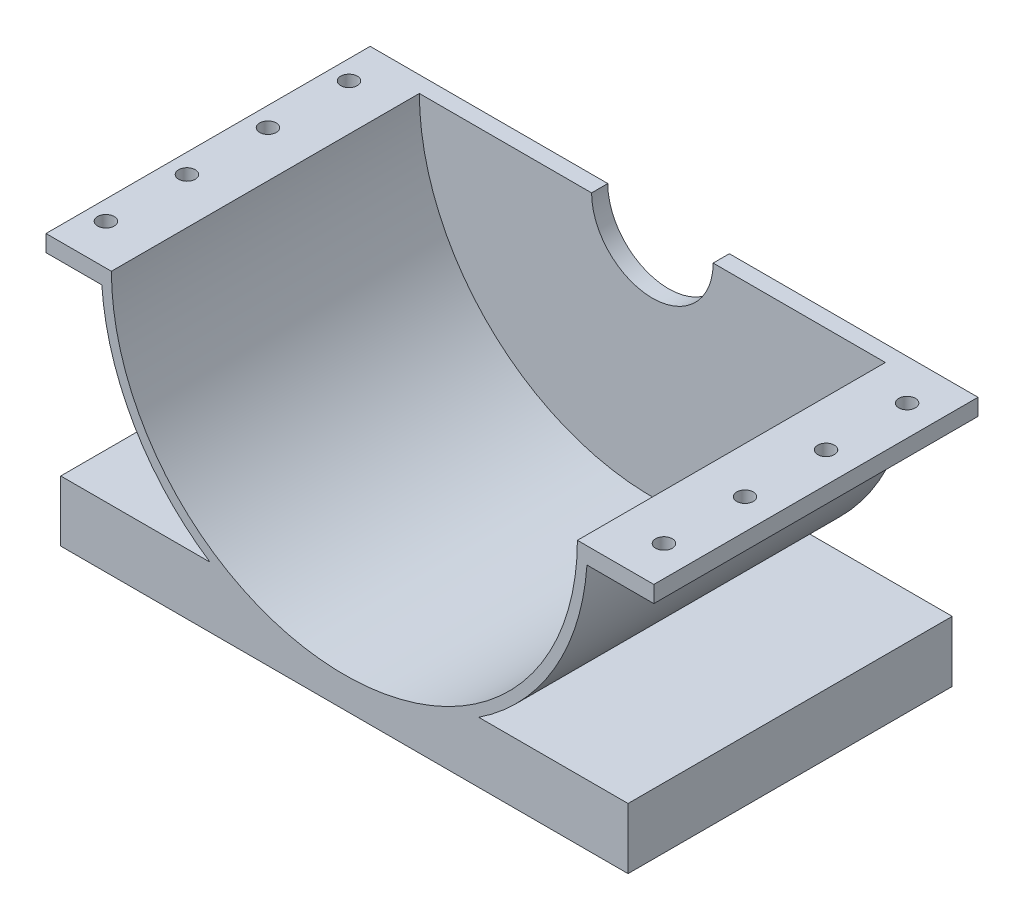
ISO-10303-21;
HEADER;
FILE_DESCRIPTION(('STEP AP214'),'2;1');
FILE_NAME('part.step','',(''),(''),'','','');
FILE_SCHEMA(('AUTOMOTIVE_DESIGN { 1 0 10303 214 1 1 1 1 }'));
ENDSEC;
DATA;
#1=APPLICATION_CONTEXT('core data for automotive mechanical design processes');
#2=APPLICATION_PROTOCOL_DEFINITION('international standard','automotive_design',2000,#1);
#3=PRODUCT_CONTEXT('',#1,'mechanical');
#4=PRODUCT('Part','Part','',(#3));
#5=PRODUCT_RELATED_PRODUCT_CATEGORY('part','',(#4));
#6=PRODUCT_DEFINITION_FORMATION('','',#4);
#7=PRODUCT_DEFINITION_CONTEXT('part definition',#1,'design');
#8=PRODUCT_DEFINITION('design','',#6,#7);
#9=PRODUCT_DEFINITION_SHAPE('','',#8);
#10=(LENGTH_UNIT() NAMED_UNIT(*) SI_UNIT(.MILLI.,.METRE.));
#11=(NAMED_UNIT(*) PLANE_ANGLE_UNIT() SI_UNIT($,.RADIAN.));
#12=(NAMED_UNIT(*) SI_UNIT($,.STERADIAN.) SOLID_ANGLE_UNIT());
#13=UNCERTAINTY_MEASURE_WITH_UNIT(LENGTH_MEASURE(1.E-05),#10,'distance_accuracy_value','');
#14=(GEOMETRIC_REPRESENTATION_CONTEXT(3) GLOBAL_UNCERTAINTY_ASSIGNED_CONTEXT((#13)) GLOBAL_UNIT_ASSIGNED_CONTEXT((#10,
#11,#12)) REPRESENTATION_CONTEXT('',''));
#15=CARTESIAN_POINT('',(0.,0.,0.));
#16=DIRECTION('',(0.,0.,1.));
#17=DIRECTION('',(1.,0.,0.));
#18=AXIS2_PLACEMENT_3D('',#15,#16,#17);
#19=CARTESIAN_POINT('',(-187.042762313304,0.,101.6));
#20=DIRECTION('',(0.,-1.,0.));
#21=DIRECTION('',(0.,0.,-1.));
#22=AXIS2_PLACEMENT_3D('',#19,#20,#21);
#23=PLANE('',#22);
#24=CARTESIAN_POINT('',(174.907237686696,0.,76.2));
#25=DIRECTION('',(0.,1.,0.));
#26=DIRECTION('',(0.,0.,1.));
#27=AXIS2_PLACEMENT_3D('',#24,#25,#26);
#28=CIRCLE('',#27,5.20699999999998);
#29=CARTESIAN_POINT('',(174.907237686696,0.,81.407));
#30=VERTEX_POINT('',#29);
#31=EDGE_CURVE('E218',#30,#30,#28,.T.);
#32=ORIENTED_EDGE('',*,*,#31,.F.);
#33=EDGE_LOOP('',(#32));
#34=FACE_BOUND('',#33,.T.);
#35=CARTESIAN_POINT('',(174.907237686696,0.,25.4));
#36=DIRECTION('',(0.,1.,0.));
#37=DIRECTION('',(0.,0.,1.));
#38=AXIS2_PLACEMENT_3D('',#35,#36,#37);
#39=CIRCLE('',#38,5.20699999999998);
#40=CARTESIAN_POINT('',(174.907237686696,0.,30.607));
#41=VERTEX_POINT('',#40);
#42=EDGE_CURVE('E402',#41,#41,#39,.T.);
#43=ORIENTED_EDGE('',*,*,#42,.F.);
#44=EDGE_LOOP('',(#43));
#45=FACE_BOUND('',#44,.T.);
#46=CARTESIAN_POINT('',(174.907237686696,0.,-25.4));
#47=DIRECTION('',(0.,1.,0.));
#48=DIRECTION('',(0.,0.,1.));
#49=AXIS2_PLACEMENT_3D('',#46,#47,#48);
#50=CIRCLE('',#49,5.20699999999998);
#51=CARTESIAN_POINT('',(174.907237686696,0.,-20.193));
#52=VERTEX_POINT('',#51);
#53=EDGE_CURVE('E405',#52,#52,#50,.T.);
#54=ORIENTED_EDGE('',*,*,#53,.F.);
#55=EDGE_LOOP('',(#54));
#56=FACE_BOUND('',#55,.T.);
#57=CARTESIAN_POINT('',(174.907237686696,0.,-76.2));
#58=DIRECTION('',(0.,1.,0.));
#59=DIRECTION('',(0.,0.,1.));
#60=AXIS2_PLACEMENT_3D('',#57,#58,#59);
#61=CIRCLE('',#60,5.20699999999998);
#62=CARTESIAN_POINT('',(174.907237686696,0.,-70.993));
#63=VERTEX_POINT('',#62);
#64=EDGE_CURVE('E399',#63,#63,#61,.T.);
#65=ORIENTED_EDGE('',*,*,#64,.F.);
#66=EDGE_LOOP('',(#65));
#67=FACE_BOUND('',#66,.T.);
#68=DIRECTION('',(-1.,0.,0.));
#69=VECTOR('',#68,1.);
#70=CARTESIAN_POINT('',(-187.042762313304,0.,-101.6));
#71=LINE('',#70,#69);
#72=CARTESIAN_POINT('',(193.957237686696,0.,-101.6));
#73=VERTEX_POINT('',#72);
#74=CARTESIAN_POINT('',(38.1,0.,-101.6));
#75=VERTEX_POINT('',#74);
#76=EDGE_CURVE('E166',#73,#75,#71,.T.);
#77=ORIENTED_EDGE('',*,*,#76,.T.);
#78=DIRECTION('',(0.,0.,1.));
#79=VECTOR('',#78,1.);
#80=CARTESIAN_POINT('',(38.1,0.,-101.6));
#81=LINE('',#80,#79);
#82=CARTESIAN_POINT('',(38.1,0.,-91.44));
#83=VERTEX_POINT('',#82);
#84=EDGE_CURVE('E151',#75,#83,#81,.T.);
#85=ORIENTED_EDGE('',*,*,#84,.T.);
#86=DIRECTION('',(-1.,0.,0.));
#87=VECTOR('',#86,1.);
#88=CARTESIAN_POINT('',(-146.05,0.,-91.44));
#89=LINE('',#88,#87);
#90=CARTESIAN_POINT('',(146.05,0.,-91.44));
#91=VERTEX_POINT('',#90);
#92=EDGE_CURVE('E236',#91,#83,#89,.T.);
#93=ORIENTED_EDGE('',*,*,#92,.F.);
#94=DIRECTION('',(0.,0.,1.));
#95=VECTOR('',#94,1.);
#96=CARTESIAN_POINT('',(146.05,0.,-91.44));
#97=LINE('',#96,#95);
#98=CARTESIAN_POINT('',(146.05,0.,101.6));
#99=VERTEX_POINT('',#98);
#100=EDGE_CURVE('E238',#91,#99,#97,.T.);
#101=ORIENTED_EDGE('',*,*,#100,.T.);
#102=DIRECTION('',(-1.,0.,0.));
#103=VECTOR('',#102,1.);
#104=CARTESIAN_POINT('',(-187.042762313304,0.,101.6));
#105=LINE('',#104,#103);
#106=CARTESIAN_POINT('',(193.957237686696,0.,101.6));
#107=VERTEX_POINT('',#106);
#108=EDGE_CURVE('E186',#107,#99,#105,.T.);
#109=ORIENTED_EDGE('',*,*,#108,.F.);
#110=DIRECTION('',(0.,0.,-1.));
#111=VECTOR('',#110,1.);
#112=CARTESIAN_POINT('',(193.957237686696,0.,101.6));
#113=LINE('',#112,#111);
#114=EDGE_CURVE('E173',#107,#73,#113,.T.);
#115=ORIENTED_EDGE('',*,*,#114,.T.);
#116=EDGE_LOOP('',(#77,#85,#93,#101,#109,#115));
#117=FACE_BOUND('',#116,.T.);
#118=ADVANCED_FACE('F37',(#34,#45,#56,#67,#117),#23,.F.);
#119=CARTESIAN_POINT('',(-187.042762313304,0.,101.6));
#120=DIRECTION('',(1.,0.,0.));
#121=DIRECTION('',(0.,0.,-1.));
#122=AXIS2_PLACEMENT_3D('',#119,#120,#121);
#123=PLANE('',#122);
#124=DIRECTION('',(0.,-1.,0.));
#125=VECTOR('',#124,1.);
#126=CARTESIAN_POINT('',(-187.042762313304,0.,-101.6));
#127=LINE('',#126,#125);
#128=CARTESIAN_POINT('',(-187.042762313304,0.,-101.6));
#129=VERTEX_POINT('',#128);
#130=CARTESIAN_POINT('',(-187.042762313304,-10.414,-101.6));
#131=VERTEX_POINT('',#130);
#132=EDGE_CURVE('E241',#129,#131,#127,.T.);
#133=ORIENTED_EDGE('',*,*,#132,.T.);
#134=DIRECTION('',(0.,0.,-1.));
#135=VECTOR('',#134,1.);
#136=CARTESIAN_POINT('',(-187.042762313304,-10.414,101.6));
#137=LINE('',#136,#135);
#138=CARTESIAN_POINT('',(-187.042762313304,-10.414,101.6));
#139=VERTEX_POINT('',#138);
#140=EDGE_CURVE('E11',#139,#131,#137,.T.);
#141=ORIENTED_EDGE('',*,*,#140,.F.);
#142=DIRECTION('',(0.,-1.,0.));
#143=VECTOR('',#142,1.);
#144=CARTESIAN_POINT('',(-187.042762313304,0.,101.6));
#145=LINE('',#144,#143);
#146=CARTESIAN_POINT('',(-187.042762313304,0.,101.6));
#147=VERTEX_POINT('',#146);
#148=EDGE_CURVE('E174',#147,#139,#145,.T.);
#149=ORIENTED_EDGE('',*,*,#148,.F.);
#150=DIRECTION('',(0.,0.,-1.));
#151=VECTOR('',#150,1.);
#152=CARTESIAN_POINT('',(-187.042762313304,0.,101.6));
#153=LINE('',#152,#151);
#154=EDGE_CURVE('E183',#147,#129,#153,.T.);
#155=ORIENTED_EDGE('',*,*,#154,.T.);
#156=EDGE_LOOP('',(#133,#141,#149,#155));
#157=FACE_BOUND('',#156,.T.);
#158=ADVANCED_FACE('F39',(#157),#123,.F.);
#159=CARTESIAN_POINT('',(-187.042762313304,-10.414,101.6));
#160=DIRECTION('',(0.,1.,0.));
#161=DIRECTION('',(0.,0.,1.));
#162=AXIS2_PLACEMENT_3D('',#159,#160,#161);
#163=PLANE('',#162);
#164=CARTESIAN_POINT('',(-174.907237686696,-10.414,76.2));
#165=DIRECTION('',(0.,1.,0.));
#166=DIRECTION('',(0.,0.,1.));
#167=AXIS2_PLACEMENT_3D('',#164,#165,#166);
#168=CIRCLE('',#167,5.20699999999998);
#169=CARTESIAN_POINT('',(-174.907237686696,-10.414,81.407));
#170=VERTEX_POINT('',#169);
#171=EDGE_CURVE('E396',#170,#170,#168,.F.);
#172=ORIENTED_EDGE('',*,*,#171,.F.);
#173=EDGE_LOOP('',(#172));
#174=FACE_BOUND('',#173,.T.);
#175=CARTESIAN_POINT('',(-174.907237686696,-10.414,25.4));
#176=DIRECTION('',(0.,1.,0.));
#177=DIRECTION('',(0.,0.,1.));
#178=AXIS2_PLACEMENT_3D('',#175,#176,#177);
#179=CIRCLE('',#178,5.20699999999998);
#180=CARTESIAN_POINT('',(-174.907237686696,-10.414,30.607));
#181=VERTEX_POINT('',#180);
#182=EDGE_CURVE('E393',#181,#181,#179,.F.);
#183=ORIENTED_EDGE('',*,*,#182,.F.);
#184=EDGE_LOOP('',(#183));
#185=FACE_BOUND('',#184,.T.);
#186=CARTESIAN_POINT('',(-174.907237686696,-10.414,-25.4));
#187=DIRECTION('',(0.,1.,0.));
#188=DIRECTION('',(0.,0.,1.));
#189=AXIS2_PLACEMENT_3D('',#186,#187,#188);
#190=CIRCLE('',#189,5.20699999999998);
#191=CARTESIAN_POINT('',(-174.907237686696,-10.414,-20.193));
#192=VERTEX_POINT('',#191);
#193=EDGE_CURVE('E390',#192,#192,#190,.F.);
#194=ORIENTED_EDGE('',*,*,#193,.F.);
#195=EDGE_LOOP('',(#194));
#196=FACE_BOUND('',#195,.T.);
#197=CARTESIAN_POINT('',(-174.907237686696,-10.414,-76.2));
#198=DIRECTION('',(0.,1.,0.));
#199=DIRECTION('',(0.,0.,1.));
#200=AXIS2_PLACEMENT_3D('',#197,#198,#199);
#201=CIRCLE('',#200,5.20699999999998);
#202=CARTESIAN_POINT('',(-174.907237686696,-10.414,-70.993));
#203=VERTEX_POINT('',#202);
#204=EDGE_CURVE('E387',#203,#203,#201,.F.);
#205=ORIENTED_EDGE('',*,*,#204,.F.);
#206=EDGE_LOOP('',(#205));
#207=FACE_BOUND('',#206,.T.);
#208=DIRECTION('',(1.,0.,0.));
#209=VECTOR('',#208,1.);
#210=CARTESIAN_POINT('',(-187.042762313304,-10.414,-101.6));
#211=LINE('',#210,#209);
#212=CARTESIAN_POINT('',(-152.04377200004,-10.4139999999999,-101.6));
#213=VERTEX_POINT('',#212);
#214=EDGE_CURVE('E268',#131,#213,#211,.T.);
#215=ORIENTED_EDGE('',*,*,#214,.T.);
#216=DIRECTION('',(0.,0.,-1.));
#217=VECTOR('',#216,1.);
#218=CARTESIAN_POINT('',(-152.04377200004,-10.4139999999999,101.6));
#219=LINE('',#218,#217);
#220=CARTESIAN_POINT('',(-152.04377200004,-10.4139999999999,101.6));
#221=VERTEX_POINT('',#220);
#222=EDGE_CURVE('E46',#221,#213,#219,.T.);
#223=ORIENTED_EDGE('',*,*,#222,.F.);
#224=DIRECTION('',(1.,0.,0.));
#225=VECTOR('',#224,1.);
#226=CARTESIAN_POINT('',(-187.042762313304,-10.414,101.6));
#227=LINE('',#226,#225);
#228=EDGE_CURVE('E177',#139,#221,#227,.T.);
#229=ORIENTED_EDGE('',*,*,#228,.F.);
#230=ORIENTED_EDGE('',*,*,#140,.T.);
#231=EDGE_LOOP('',(#215,#223,#229,#230));
#232=FACE_BOUND('',#231,.T.);
#233=ADVANCED_FACE('F331',(#174,#185,#196,#207,#232),#163,.F.);
#234=CARTESIAN_POINT('',(0.,0.,101.6));
#235=DIRECTION('',(0.,0.,-1.));
#236=DIRECTION('',(-1.,0.,0.));
#237=AXIS2_PLACEMENT_3D('',#234,#235,#236);
#238=CYLINDRICAL_SURFACE('',#237,152.4);
#239=CARTESIAN_POINT('',(0.,0.,-101.6));
#240=DIRECTION('',(0.,0.,1.));
#241=DIRECTION('',(1.,0.,0.));
#242=AXIS2_PLACEMENT_3D('',#239,#240,#241);
#243=CIRCLE('',#242,152.4);
#244=CARTESIAN_POINT('',(-84.2422696750272,-127.,-101.6));
#245=VERTEX_POINT('',#244);
#246=EDGE_CURVE('E270',#213,#245,#243,.T.);
#247=ORIENTED_EDGE('',*,*,#246,.T.);
#248=DIRECTION('',(0.,0.,-1.));
#249=VECTOR('',#248,1.);
#250=CARTESIAN_POINT('',(-84.2422696750272,-127.,101.6));
#251=LINE('',#250,#249);
#252=CARTESIAN_POINT('',(-84.2422696750272,-127.,101.6));
#253=VERTEX_POINT('',#252);
#254=EDGE_CURVE('E209',#253,#245,#251,.T.);
#255=ORIENTED_EDGE('',*,*,#254,.F.);
#256=CARTESIAN_POINT('',(0.,0.,101.6));
#257=DIRECTION('',(0.,0.,1.));
#258=DIRECTION('',(1.,0.,0.));
#259=AXIS2_PLACEMENT_3D('',#256,#257,#258);
#260=CIRCLE('',#259,152.4);
#261=EDGE_CURVE('E245',#221,#253,#260,.T.);
#262=ORIENTED_EDGE('',*,*,#261,.F.);
#263=ORIENTED_EDGE('',*,*,#222,.T.);
#264=EDGE_LOOP('',(#247,#255,#262,#263));
#265=FACE_BOUND('',#264,.T.);
#266=ADVANCED_FACE('F327',(#265),#238,.T.);
#267=CARTESIAN_POINT('',(-177.8,-127.,101.6));
#268=DIRECTION('',(0.,-1.,0.));
#269=DIRECTION('',(0.,0.,-1.));
#270=AXIS2_PLACEMENT_3D('',#267,#268,#269);
#271=PLANE('',#270);
#272=DIRECTION('',(-1.,0.,0.));
#273=VECTOR('',#272,1.);
#274=CARTESIAN_POINT('',(-177.8,-127.,-101.6));
#275=LINE('',#274,#273);
#276=CARTESIAN_POINT('',(-177.8,-127.,-101.6));
#277=VERTEX_POINT('',#276);
#278=EDGE_CURVE('E272',#245,#277,#275,.T.);
#279=ORIENTED_EDGE('',*,*,#278,.T.);
#280=DIRECTION('',(0.,0.,-1.));
#281=VECTOR('',#280,1.);
#282=CARTESIAN_POINT('',(-177.8,-127.,101.6));
#283=LINE('',#282,#281);
#284=CARTESIAN_POINT('',(-177.8,-127.,101.6));
#285=VERTEX_POINT('',#284);
#286=EDGE_CURVE('E206',#285,#277,#283,.T.);
#287=ORIENTED_EDGE('',*,*,#286,.F.);
#288=DIRECTION('',(-1.,0.,0.));
#289=VECTOR('',#288,1.);
#290=CARTESIAN_POINT('',(-177.8,-127.,101.6));
#291=LINE('',#290,#289);
#292=EDGE_CURVE('E247',#253,#285,#291,.T.);
#293=ORIENTED_EDGE('',*,*,#292,.F.);
#294=ORIENTED_EDGE('',*,*,#254,.T.);
#295=EDGE_LOOP('',(#279,#287,#293,#294));
#296=FACE_BOUND('',#295,.T.);
#297=ADVANCED_FACE('F323',(#296),#271,.F.);
#298=CARTESIAN_POINT('',(-177.8,-127.,101.6));
#299=DIRECTION('',(1.,0.,0.));
#300=DIRECTION('',(0.,1.,0.));
#301=AXIS2_PLACEMENT_3D('',#298,#299,#300);
#302=PLANE('',#301);
#303=DIRECTION('',(0.,-1.,0.));
#304=VECTOR('',#303,1.);
#305=CARTESIAN_POINT('',(-177.8,-127.,-101.6));
#306=LINE('',#305,#304);
#307=CARTESIAN_POINT('',(-177.8,-165.1,-101.6));
#308=VERTEX_POINT('',#307);
#309=EDGE_CURVE('E274',#277,#308,#306,.T.);
#310=ORIENTED_EDGE('',*,*,#309,.T.);
#311=DIRECTION('',(0.,0.,-1.));
#312=VECTOR('',#311,1.);
#313=CARTESIAN_POINT('',(-177.8,-165.1,101.6));
#314=LINE('',#313,#312);
#315=CARTESIAN_POINT('',(-177.8,-165.1,101.6));
#316=VERTEX_POINT('',#315);
#317=EDGE_CURVE('E203',#316,#308,#314,.T.);
#318=ORIENTED_EDGE('',*,*,#317,.F.);
#319=DIRECTION('',(0.,-1.,0.));
#320=VECTOR('',#319,1.);
#321=CARTESIAN_POINT('',(-177.8,-127.,101.6));
#322=LINE('',#321,#320);
#323=EDGE_CURVE('E249',#285,#316,#322,.T.);
#324=ORIENTED_EDGE('',*,*,#323,.F.);
#325=ORIENTED_EDGE('',*,*,#286,.T.);
#326=EDGE_LOOP('',(#310,#318,#324,#325));
#327=FACE_BOUND('',#326,.T.);
#328=ADVANCED_FACE('F319',(#327),#302,.F.);
#329=CARTESIAN_POINT('',(-177.8,-165.1,101.6));
#330=DIRECTION('',(0.,1.,0.));
#331=DIRECTION('',(0.,0.,1.));
#332=AXIS2_PLACEMENT_3D('',#329,#330,#331);
#333=PLANE('',#332);
#334=DIRECTION('',(1.,0.,0.));
#335=VECTOR('',#334,1.);
#336=CARTESIAN_POINT('',(-177.8,-165.1,-101.6));
#337=LINE('',#336,#335);
#338=CARTESIAN_POINT('',(177.8,-165.1,-101.6));
#339=VERTEX_POINT('',#338);
#340=EDGE_CURVE('E276',#308,#339,#337,.T.);
#341=ORIENTED_EDGE('',*,*,#340,.T.);
#342=DIRECTION('',(0.,0.,-1.));
#343=VECTOR('',#342,1.);
#344=CARTESIAN_POINT('',(177.8,-165.1,101.6));
#345=LINE('',#344,#343);
#346=CARTESIAN_POINT('',(177.8,-165.1,101.6));
#347=VERTEX_POINT('',#346);
#348=EDGE_CURVE('E200',#347,#339,#345,.T.);
#349=ORIENTED_EDGE('',*,*,#348,.F.);
#350=DIRECTION('',(1.,0.,0.));
#351=VECTOR('',#350,1.);
#352=CARTESIAN_POINT('',(-177.8,-165.1,101.6));
#353=LINE('',#352,#351);
#354=EDGE_CURVE('E251',#316,#347,#353,.T.);
#355=ORIENTED_EDGE('',*,*,#354,.F.);
#356=ORIENTED_EDGE('',*,*,#317,.T.);
#357=EDGE_LOOP('',(#341,#349,#355,#356));
#358=FACE_BOUND('',#357,.T.);
#359=ADVANCED_FACE('F314',(#358),#333,.F.);
#360=CARTESIAN_POINT('',(177.8,-127.,101.6));
#361=DIRECTION('',(-1.,0.,0.));
#362=DIRECTION('',(0.,-1.,0.));
#363=AXIS2_PLACEMENT_3D('',#360,#361,#362);
#364=PLANE('',#363);
#365=DIRECTION('',(0.,1.,0.));
#366=VECTOR('',#365,1.);
#367=CARTESIAN_POINT('',(177.8,-127.,-101.6));
#368=LINE('',#367,#366);
#369=CARTESIAN_POINT('',(177.8,-127.,-101.6));
#370=VERTEX_POINT('',#369);
#371=EDGE_CURVE('E278',#339,#370,#368,.T.);
#372=ORIENTED_EDGE('',*,*,#371,.T.);
#373=DIRECTION('',(0.,0.,-1.));
#374=VECTOR('',#373,1.);
#375=CARTESIAN_POINT('',(177.8,-127.,101.6));
#376=LINE('',#375,#374);
#377=CARTESIAN_POINT('',(177.8,-127.,101.6));
#378=VERTEX_POINT('',#377);
#379=EDGE_CURVE('E197',#378,#370,#376,.T.);
#380=ORIENTED_EDGE('',*,*,#379,.F.);
#381=DIRECTION('',(0.,1.,0.));
#382=VECTOR('',#381,1.);
#383=CARTESIAN_POINT('',(177.8,-127.,101.6));
#384=LINE('',#383,#382);
#385=EDGE_CURVE('E253',#347,#378,#384,.T.);
#386=ORIENTED_EDGE('',*,*,#385,.F.);
#387=ORIENTED_EDGE('',*,*,#348,.T.);
#388=EDGE_LOOP('',(#372,#380,#386,#387));
#389=FACE_BOUND('',#388,.T.);
#390=ADVANCED_FACE('F308',(#389),#364,.F.);
#391=CARTESIAN_POINT('',(84.2422696750272,-127.,101.6));
#392=DIRECTION('',(0.,-1.,0.));
#393=DIRECTION('',(0.,0.,-1.));
#394=AXIS2_PLACEMENT_3D('',#391,#392,#393);
#395=PLANE('',#394);
#396=DIRECTION('',(-1.,0.,0.));
#397=VECTOR('',#396,1.);
#398=CARTESIAN_POINT('',(84.2422696750272,-127.,-101.6));
#399=LINE('',#398,#397);
#400=CARTESIAN_POINT('',(84.2422696750272,-127.,-101.6));
#401=VERTEX_POINT('',#400);
#402=EDGE_CURVE('E280',#370,#401,#399,.T.);
#403=ORIENTED_EDGE('',*,*,#402,.T.);
#404=DIRECTION('',(0.,0.,-1.));
#405=VECTOR('',#404,1.);
#406=CARTESIAN_POINT('',(84.2422696750272,-127.,101.6));
#407=LINE('',#406,#405);
#408=CARTESIAN_POINT('',(84.2422696750272,-127.,101.6));
#409=VERTEX_POINT('',#408);
#410=EDGE_CURVE('E194',#409,#401,#407,.T.);
#411=ORIENTED_EDGE('',*,*,#410,.F.);
#412=DIRECTION('',(-1.,0.,0.));
#413=VECTOR('',#412,1.);
#414=CARTESIAN_POINT('',(84.2422696750272,-127.,101.6));
#415=LINE('',#414,#413);
#416=EDGE_CURVE('E255',#378,#409,#415,.T.);
#417=ORIENTED_EDGE('',*,*,#416,.F.);
#418=ORIENTED_EDGE('',*,*,#379,.T.);
#419=EDGE_LOOP('',(#403,#411,#417,#418));
#420=FACE_BOUND('',#419,.T.);
#421=ADVANCED_FACE('F306',(#420),#395,.F.);
#422=CARTESIAN_POINT('',(0.,0.,101.6));
#423=DIRECTION('',(0.,0.,-1.));
#424=DIRECTION('',(-1.,0.,0.));
#425=AXIS2_PLACEMENT_3D('',#422,#423,#424);
#426=CYLINDRICAL_SURFACE('',#425,152.4);
#427=CARTESIAN_POINT('',(0.,0.,-101.6));
#428=DIRECTION('',(0.,0.,1.));
#429=DIRECTION('',(1.,0.,0.));
#430=AXIS2_PLACEMENT_3D('',#427,#428,#429);
#431=CIRCLE('',#430,152.4);
#432=CARTESIAN_POINT('',(152.04377200004,-10.414,-101.6));
#433=VERTEX_POINT('',#432);
#434=EDGE_CURVE('E282',#401,#433,#431,.T.);
#435=ORIENTED_EDGE('',*,*,#434,.T.);
#436=DIRECTION('',(0.,0.,-1.));
#437=VECTOR('',#436,1.);
#438=CARTESIAN_POINT('',(152.04377200004,-10.414,101.6));
#439=LINE('',#438,#437);
#440=CARTESIAN_POINT('',(152.04377200004,-10.414,101.6));
#441=VERTEX_POINT('',#440);
#442=EDGE_CURVE('E191',#441,#433,#439,.T.);
#443=ORIENTED_EDGE('',*,*,#442,.F.);
#444=CARTESIAN_POINT('',(0.,0.,101.6));
#445=DIRECTION('',(0.,0.,1.));
#446=DIRECTION('',(1.,0.,0.));
#447=AXIS2_PLACEMENT_3D('',#444,#445,#446);
#448=CIRCLE('',#447,152.4);
#449=EDGE_CURVE('E257',#409,#441,#448,.T.);
#450=ORIENTED_EDGE('',*,*,#449,.F.);
#451=ORIENTED_EDGE('',*,*,#410,.T.);
#452=EDGE_LOOP('',(#435,#443,#450,#451));
#453=FACE_BOUND('',#452,.T.);
#454=ADVANCED_FACE('F295',(#453),#426,.T.);
#455=CARTESIAN_POINT('',(152.04377200004,-10.414,101.6));
#456=DIRECTION('',(0.,1.,0.));
#457=DIRECTION('',(0.,0.,1.));
#458=AXIS2_PLACEMENT_3D('',#455,#456,#457);
#459=PLANE('',#458);
#460=CARTESIAN_POINT('',(174.907237686696,-10.414,76.2));
#461=DIRECTION('',(0.,1.,0.));
#462=DIRECTION('',(0.,0.,1.));
#463=AXIS2_PLACEMENT_3D('',#460,#461,#462);
#464=CIRCLE('',#463,5.20699999999998);
#465=CARTESIAN_POINT('',(174.907237686696,-10.414,81.407));
#466=VERTEX_POINT('',#465);
#467=EDGE_CURVE('E41',#466,#466,#464,.T.);
#468=ORIENTED_EDGE('',*,*,#467,.T.);
#469=EDGE_LOOP('',(#468));
#470=FACE_BOUND('',#469,.T.);
#471=CARTESIAN_POINT('',(174.907237686696,-10.414,25.4));
#472=DIRECTION('',(0.,1.,0.));
#473=DIRECTION('',(0.,0.,1.));
#474=AXIS2_PLACEMENT_3D('',#471,#472,#473);
#475=CIRCLE('',#474,5.20699999999998);
#476=CARTESIAN_POINT('',(174.907237686696,-10.414,30.607));
#477=VERTEX_POINT('',#476);
#478=EDGE_CURVE('E220',#477,#477,#475,.T.);
#479=ORIENTED_EDGE('',*,*,#478,.T.);
#480=EDGE_LOOP('',(#479));
#481=FACE_BOUND('',#480,.T.);
#482=CARTESIAN_POINT('',(174.907237686696,-10.414,-25.4));
#483=DIRECTION('',(0.,1.,0.));
#484=DIRECTION('',(0.,0.,1.));
#485=AXIS2_PLACEMENT_3D('',#482,#483,#484);
#486=CIRCLE('',#485,5.20699999999998);
#487=CARTESIAN_POINT('',(174.907237686696,-10.414,-20.193));
#488=VERTEX_POINT('',#487);
#489=EDGE_CURVE('E217',#488,#488,#486,.T.);
#490=ORIENTED_EDGE('',*,*,#489,.T.);
#491=EDGE_LOOP('',(#490));
#492=FACE_BOUND('',#491,.T.);
#493=CARTESIAN_POINT('',(174.907237686696,-10.414,-76.2));
#494=DIRECTION('',(0.,1.,0.));
#495=DIRECTION('',(0.,0.,1.));
#496=AXIS2_PLACEMENT_3D('',#493,#494,#495);
#497=CIRCLE('',#496,5.20699999999998);
#498=CARTESIAN_POINT('',(174.907237686696,-10.414,-70.993));
#499=VERTEX_POINT('',#498);
#500=EDGE_CURVE('E214',#499,#499,#497,.T.);
#501=ORIENTED_EDGE('',*,*,#500,.T.);
#502=EDGE_LOOP('',(#501));
#503=FACE_BOUND('',#502,.T.);
#504=DIRECTION('',(1.,0.,0.));
#505=VECTOR('',#504,1.);
#506=CARTESIAN_POINT('',(152.04377200004,-10.414,-101.6));
#507=LINE('',#506,#505);
#508=CARTESIAN_POINT('',(193.957237686696,-10.414,-101.6));
#509=VERTEX_POINT('',#508);
#510=EDGE_CURVE('E283',#433,#509,#507,.T.);
#511=ORIENTED_EDGE('',*,*,#510,.T.);
#512=DIRECTION('',(0.,0.,-1.));
#513=VECTOR('',#512,1.);
#514=CARTESIAN_POINT('',(193.957237686696,-10.414,101.6));
#515=LINE('',#514,#513);
#516=CARTESIAN_POINT('',(193.957237686696,-10.414,101.6));
#517=VERTEX_POINT('',#516);
#518=EDGE_CURVE('E188',#517,#509,#515,.T.);
#519=ORIENTED_EDGE('',*,*,#518,.F.);
#520=DIRECTION('',(1.,0.,0.));
#521=VECTOR('',#520,1.);
#522=CARTESIAN_POINT('',(152.04377200004,-10.414,101.6));
#523=LINE('',#522,#521);
#524=EDGE_CURVE('E259',#441,#517,#523,.T.);
#525=ORIENTED_EDGE('',*,*,#524,.F.);
#526=ORIENTED_EDGE('',*,*,#442,.T.);
#527=EDGE_LOOP('',(#511,#519,#525,#526));
#528=FACE_BOUND('',#527,.T.);
#529=ADVANCED_FACE('F299',(#470,#481,#492,#503,#528),#459,.F.);
#530=CARTESIAN_POINT('',(193.957237686696,-10.414,101.6));
#531=DIRECTION('',(-1.,0.,0.));
#532=DIRECTION('',(0.,0.,1.));
#533=AXIS2_PLACEMENT_3D('',#530,#531,#532);
#534=PLANE('',#533);
#535=DIRECTION('',(0.,1.,0.));
#536=VECTOR('',#535,1.);
#537=CARTESIAN_POINT('',(193.957237686696,-10.414,-101.6));
#538=LINE('',#537,#536);
#539=EDGE_CURVE('E179',#509,#73,#538,.T.);
#540=ORIENTED_EDGE('',*,*,#539,.T.);
#541=ORIENTED_EDGE('',*,*,#114,.F.);
#542=DIRECTION('',(0.,1.,0.));
#543=VECTOR('',#542,1.);
#544=CARTESIAN_POINT('',(193.957237686696,-10.414,101.6));
#545=LINE('',#544,#543);
#546=EDGE_CURVE('E261',#517,#107,#545,.T.);
#547=ORIENTED_EDGE('',*,*,#546,.F.);
#548=ORIENTED_EDGE('',*,*,#518,.T.);
#549=EDGE_LOOP('',(#540,#541,#547,#548));
#550=FACE_BOUND('',#549,.T.);
#551=ADVANCED_FACE('F288',(#550),#534,.F.);
#552=CARTESIAN_POINT('',(-174.907237686696,0.,76.2));
#553=DIRECTION('',(0.,-1.,0.));
#554=DIRECTION('',(0.,0.,1.));
#555=AXIS2_PLACEMENT_3D('',#552,#553,#554);
#556=CIRCLE('',#555,5.20699999999998);
#557=CARTESIAN_POINT('',(-174.907237686696,0.,81.407));
#558=VERTEX_POINT('',#557);
#559=EDGE_CURVE('E370',#558,#558,#556,.T.);
#560=ORIENTED_EDGE('',*,*,#559,.T.);
#561=EDGE_LOOP('',(#560));
#562=FACE_BOUND('',#561,.T.);
#563=CARTESIAN_POINT('',(-174.907237686696,0.,25.4));
#564=DIRECTION('',(0.,-1.,0.));
#565=DIRECTION('',(0.,0.,1.));
#566=AXIS2_PLACEMENT_3D('',#563,#564,#565);
#567=CIRCLE('',#566,5.20699999999998);
#568=CARTESIAN_POINT('',(-174.907237686696,0.,30.607));
#569=VERTEX_POINT('',#568);
#570=EDGE_CURVE('E374',#569,#569,#567,.T.);
#571=ORIENTED_EDGE('',*,*,#570,.T.);
#572=EDGE_LOOP('',(#571));
#573=FACE_BOUND('',#572,.T.);
#574=CARTESIAN_POINT('',(-174.907237686696,0.,-25.4));
#575=DIRECTION('',(0.,-1.,0.));
#576=DIRECTION('',(0.,0.,1.));
#577=AXIS2_PLACEMENT_3D('',#574,#575,#576);
#578=CIRCLE('',#577,5.20699999999998);
#579=CARTESIAN_POINT('',(-174.907237686696,0.,-20.193));
#580=VERTEX_POINT('',#579);
#581=EDGE_CURVE('E378',#580,#580,#578,.T.);
#582=ORIENTED_EDGE('',*,*,#581,.T.);
#583=EDGE_LOOP('',(#582));
#584=FACE_BOUND('',#583,.T.);
#585=CARTESIAN_POINT('',(-174.907237686696,0.,-76.2));
#586=DIRECTION('',(0.,-1.,0.));
#587=DIRECTION('',(0.,0.,1.));
#588=AXIS2_PLACEMENT_3D('',#585,#586,#587);
#589=CIRCLE('',#588,5.20699999999998);
#590=CARTESIAN_POINT('',(-174.907237686696,0.,-70.993));
#591=VERTEX_POINT('',#590);
#592=EDGE_CURVE('E381',#591,#591,#589,.T.);
#593=ORIENTED_EDGE('',*,*,#592,.T.);
#594=EDGE_LOOP('',(#593));
#595=FACE_BOUND('',#594,.T.);
#596=CARTESIAN_POINT('',(-38.1,0.,-91.44));
#597=VERTEX_POINT('',#596);
#598=CARTESIAN_POINT('',(-146.05,0.,-91.44));
#599=VERTEX_POINT('',#598);
#600=EDGE_CURVE('E235',#597,#599,#89,.T.);
#601=ORIENTED_EDGE('',*,*,#600,.F.);
#602=DIRECTION('',(0.,0.,1.));
#603=VECTOR('',#602,1.);
#604=CARTESIAN_POINT('',(-38.1,0.,-101.6));
#605=LINE('',#604,#603);
#606=CARTESIAN_POINT('',(-38.1,0.,-101.6));
#607=VERTEX_POINT('',#606);
#608=EDGE_CURVE('E54',#607,#597,#605,.T.);
#609=ORIENTED_EDGE('',*,*,#608,.F.);
#610=EDGE_CURVE('E168',#607,#129,#71,.T.);
#611=ORIENTED_EDGE('',*,*,#610,.T.);
#612=ORIENTED_EDGE('',*,*,#154,.F.);
#613=CARTESIAN_POINT('',(-146.05,0.,101.6));
#614=VERTEX_POINT('',#613);
#615=EDGE_CURVE('E263',#614,#147,#105,.T.);
#616=ORIENTED_EDGE('',*,*,#615,.F.);
#617=DIRECTION('',(0.,0.,1.));
#618=VECTOR('',#617,1.);
#619=CARTESIAN_POINT('',(-146.05,0.,-91.44));
#620=LINE('',#619,#618);
#621=EDGE_CURVE('E62',#599,#614,#620,.T.);
#622=ORIENTED_EDGE('',*,*,#621,.F.);
#623=EDGE_LOOP('',(#601,#609,#611,#612,#616,#622));
#624=FACE_BOUND('',#623,.T.);
#625=ADVANCED_FACE('F339',(#562,#573,#584,#595,#624),#23,.F.);
#626=CARTESIAN_POINT('',(0.,0.,101.6));
#627=DIRECTION('',(0.,0.,1.));
#628=DIRECTION('',(1.,0.,0.));
#629=AXIS2_PLACEMENT_3D('',#626,#627,#628);
#630=PLANE('',#629);
#631=CARTESIAN_POINT('',(0.,0.,101.6));
#632=DIRECTION('',(0.,0.,1.));
#633=DIRECTION('',(1.,0.,0.));
#634=AXIS2_PLACEMENT_3D('',#631,#632,#633);
#635=CIRCLE('',#634,146.05);
#636=EDGE_CURVE('E230',#614,#99,#635,.T.);
#637=ORIENTED_EDGE('',*,*,#636,.F.);
#638=ORIENTED_EDGE('',*,*,#615,.T.);
#639=ORIENTED_EDGE('',*,*,#148,.T.);
#640=ORIENTED_EDGE('',*,*,#228,.T.);
#641=ORIENTED_EDGE('',*,*,#261,.T.);
#642=ORIENTED_EDGE('',*,*,#292,.T.);
#643=ORIENTED_EDGE('',*,*,#323,.T.);
#644=ORIENTED_EDGE('',*,*,#354,.T.);
#645=ORIENTED_EDGE('',*,*,#385,.T.);
#646=ORIENTED_EDGE('',*,*,#416,.T.);
#647=ORIENTED_EDGE('',*,*,#449,.T.);
#648=ORIENTED_EDGE('',*,*,#524,.T.);
#649=ORIENTED_EDGE('',*,*,#546,.T.);
#650=ORIENTED_EDGE('',*,*,#108,.T.);
#651=EDGE_LOOP('',(#637,#638,#639,#640,#641,#642,#643,#644,#645,#646,#647,#648,#649,#650));
#652=FACE_BOUND('',#651,.T.);
#653=ADVANCED_FACE('F301',(#652),#630,.T.);
#654=CARTESIAN_POINT('',(0.,0.,-101.6));
#655=DIRECTION('',(0.,0.,1.));
#656=DIRECTION('',(1.,0.,0.));
#657=AXIS2_PLACEMENT_3D('',#654,#655,#656);
#658=PLANE('',#657);
#659=ORIENTED_EDGE('',*,*,#610,.F.);
#660=CARTESIAN_POINT('',(0.,0.,-101.6));
#661=DIRECTION('',(0.,0.,1.));
#662=DIRECTION('',(1.,0.,0.));
#663=AXIS2_PLACEMENT_3D('',#660,#661,#662);
#664=CIRCLE('',#663,38.1);
#665=EDGE_CURVE('E154',#607,#75,#664,.T.);
#666=ORIENTED_EDGE('',*,*,#665,.T.);
#667=ORIENTED_EDGE('',*,*,#76,.F.);
#668=ORIENTED_EDGE('',*,*,#539,.F.);
#669=ORIENTED_EDGE('',*,*,#510,.F.);
#670=ORIENTED_EDGE('',*,*,#434,.F.);
#671=ORIENTED_EDGE('',*,*,#402,.F.);
#672=ORIENTED_EDGE('',*,*,#371,.F.);
#673=ORIENTED_EDGE('',*,*,#340,.F.);
#674=ORIENTED_EDGE('',*,*,#309,.F.);
#675=ORIENTED_EDGE('',*,*,#278,.F.);
#676=ORIENTED_EDGE('',*,*,#246,.F.);
#677=ORIENTED_EDGE('',*,*,#214,.F.);
#678=ORIENTED_EDGE('',*,*,#132,.F.);
#679=EDGE_LOOP('',(#659,#666,#667,#668,#669,#670,#671,#672,#673,#674,#675,#676,#677,#678));
#680=FACE_BOUND('',#679,.T.);
#681=ADVANCED_FACE('F164',(#680),#658,.F.);
#682=CARTESIAN_POINT('',(0.,0.,-91.44));
#683=DIRECTION('',(0.,0.,1.));
#684=DIRECTION('',(1.,0.,0.));
#685=AXIS2_PLACEMENT_3D('',#682,#683,#684);
#686=CYLINDRICAL_SURFACE('',#685,146.05);
#687=ORIENTED_EDGE('',*,*,#636,.T.);
#688=ORIENTED_EDGE('',*,*,#100,.F.);
#689=CARTESIAN_POINT('',(0.,0.,-91.44));
#690=DIRECTION('',(0.,0.,1.));
#691=DIRECTION('',(1.,0.,0.));
#692=AXIS2_PLACEMENT_3D('',#689,#690,#691);
#693=CIRCLE('',#692,146.05);
#694=EDGE_CURVE('E232',#599,#91,#693,.T.);
#695=ORIENTED_EDGE('',*,*,#694,.F.);
#696=ORIENTED_EDGE('',*,*,#621,.T.);
#697=EDGE_LOOP('',(#687,#688,#695,#696));
#698=FACE_BOUND('',#697,.T.);
#699=ADVANCED_FACE('F342',(#698),#686,.F.);
#700=CARTESIAN_POINT('',(0.,0.,-91.44));
#701=DIRECTION('',(0.,0.,1.));
#702=DIRECTION('',(1.,0.,0.));
#703=AXIS2_PLACEMENT_3D('',#700,#701,#702);
#704=PLANE('',#703);
#705=CARTESIAN_POINT('',(0.,0.,-91.44));
#706=DIRECTION('',(0.,0.,1.));
#707=DIRECTION('',(1.,0.,0.));
#708=AXIS2_PLACEMENT_3D('',#705,#706,#707);
#709=CIRCLE('',#708,38.1);
#710=EDGE_CURVE('E155',#597,#83,#709,.T.);
#711=ORIENTED_EDGE('',*,*,#710,.F.);
#712=ORIENTED_EDGE('',*,*,#600,.T.);
#713=ORIENTED_EDGE('',*,*,#694,.T.);
#714=ORIENTED_EDGE('',*,*,#92,.T.);
#715=EDGE_LOOP('',(#711,#712,#713,#714));
#716=FACE_BOUND('',#715,.T.);
#717=ADVANCED_FACE('F341',(#716),#704,.T.);
#718=CARTESIAN_POINT('',(0.,0.,-101.6));
#719=DIRECTION('',(0.,0.,1.));
#720=DIRECTION('',(1.,0.,0.));
#721=AXIS2_PLACEMENT_3D('',#718,#719,#720);
#722=CYLINDRICAL_SURFACE('',#721,38.1);
#723=ORIENTED_EDGE('',*,*,#710,.T.);
#724=ORIENTED_EDGE('',*,*,#84,.F.);
#725=ORIENTED_EDGE('',*,*,#665,.F.);
#726=ORIENTED_EDGE('',*,*,#608,.T.);
#727=EDGE_LOOP('',(#723,#724,#725,#726));
#728=FACE_BOUND('',#727,.T.);
#729=ADVANCED_FACE('F153',(#728),#722,.F.);
#730=CARTESIAN_POINT('',(174.907237686696,-82.0419999999999,-76.2));
#731=DIRECTION('',(0.,1.,0.));
#732=DIRECTION('',(0.,0.,1.));
#733=AXIS2_PLACEMENT_3D('',#730,#731,#732);
#734=CYLINDRICAL_SURFACE('',#733,5.20699999999998);
#735=ORIENTED_EDGE('',*,*,#64,.T.);
#736=EDGE_LOOP('',(#735));
#737=FACE_BOUND('',#736,.T.);
#738=ORIENTED_EDGE('',*,*,#500,.F.);
#739=EDGE_LOOP('',(#738));
#740=FACE_BOUND('',#739,.T.);
#741=ADVANCED_FACE('F410',(#737,#740),#734,.F.);
#742=CARTESIAN_POINT('',(174.907237686696,-82.0419999999999,-25.4));
#743=DIRECTION('',(0.,1.,0.));
#744=DIRECTION('',(0.,0.,1.));
#745=AXIS2_PLACEMENT_3D('',#742,#743,#744);
#746=CYLINDRICAL_SURFACE('',#745,5.20699999999998);
#747=ORIENTED_EDGE('',*,*,#53,.T.);
#748=EDGE_LOOP('',(#747));
#749=FACE_BOUND('',#748,.T.);
#750=ORIENTED_EDGE('',*,*,#489,.F.);
#751=EDGE_LOOP('',(#750));
#752=FACE_BOUND('',#751,.T.);
#753=ADVANCED_FACE('F414',(#749,#752),#746,.F.);
#754=CARTESIAN_POINT('',(174.907237686696,-82.0419999999999,25.4));
#755=DIRECTION('',(0.,1.,0.));
#756=DIRECTION('',(0.,0.,1.));
#757=AXIS2_PLACEMENT_3D('',#754,#755,#756);
#758=CYLINDRICAL_SURFACE('',#757,5.20699999999998);
#759=ORIENTED_EDGE('',*,*,#42,.T.);
#760=EDGE_LOOP('',(#759));
#761=FACE_BOUND('',#760,.T.);
#762=ORIENTED_EDGE('',*,*,#478,.F.);
#763=EDGE_LOOP('',(#762));
#764=FACE_BOUND('',#763,.T.);
#765=ADVANCED_FACE('F460',(#761,#764),#758,.F.);
#766=CARTESIAN_POINT('',(174.907237686696,-82.0419999999999,76.2));
#767=DIRECTION('',(0.,1.,0.));
#768=DIRECTION('',(0.,0.,1.));
#769=AXIS2_PLACEMENT_3D('',#766,#767,#768);
#770=CYLINDRICAL_SURFACE('',#769,5.20699999999998);
#771=ORIENTED_EDGE('',*,*,#31,.T.);
#772=EDGE_LOOP('',(#771));
#773=FACE_BOUND('',#772,.T.);
#774=ORIENTED_EDGE('',*,*,#467,.F.);
#775=EDGE_LOOP('',(#774));
#776=FACE_BOUND('',#775,.T.);
#777=ADVANCED_FACE('F451',(#773,#776),#770,.F.);
#778=CARTESIAN_POINT('',(-174.907237686696,-82.0419999999999,-76.2));
#779=DIRECTION('',(0.,1.,0.));
#780=DIRECTION('',(0.,0.,1.));
#781=AXIS2_PLACEMENT_3D('',#778,#779,#780);
#782=CYLINDRICAL_SURFACE('',#781,5.20699999999998);
#783=ORIENTED_EDGE('',*,*,#592,.F.);
#784=EDGE_LOOP('',(#783));
#785=FACE_BOUND('',#784,.T.);
#786=ORIENTED_EDGE('',*,*,#204,.T.);
#787=EDGE_LOOP('',(#786));
#788=FACE_BOUND('',#787,.T.);
#789=ADVANCED_FACE('F448',(#785,#788),#782,.F.);
#790=CARTESIAN_POINT('',(-174.907237686696,-82.0419999999999,-25.4));
#791=DIRECTION('',(0.,1.,0.));
#792=DIRECTION('',(0.,0.,1.));
#793=AXIS2_PLACEMENT_3D('',#790,#791,#792);
#794=CYLINDRICAL_SURFACE('',#793,5.20699999999998);
#795=ORIENTED_EDGE('',*,*,#581,.F.);
#796=EDGE_LOOP('',(#795));
#797=FACE_BOUND('',#796,.T.);
#798=ORIENTED_EDGE('',*,*,#193,.T.);
#799=EDGE_LOOP('',(#798));
#800=FACE_BOUND('',#799,.T.);
#801=ADVANCED_FACE('F450',(#797,#800),#794,.F.);
#802=CARTESIAN_POINT('',(-174.907237686696,-82.0419999999999,25.4));
#803=DIRECTION('',(0.,1.,0.));
#804=DIRECTION('',(0.,0.,1.));
#805=AXIS2_PLACEMENT_3D('',#802,#803,#804);
#806=CYLINDRICAL_SURFACE('',#805,5.20699999999998);
#807=ORIENTED_EDGE('',*,*,#570,.F.);
#808=EDGE_LOOP('',(#807));
#809=FACE_BOUND('',#808,.T.);
#810=ORIENTED_EDGE('',*,*,#182,.T.);
#811=EDGE_LOOP('',(#810));
#812=FACE_BOUND('',#811,.T.);
#813=ADVANCED_FACE('F457',(#809,#812),#806,.F.);
#814=CARTESIAN_POINT('',(-174.907237686696,-82.0419999999999,76.2));
#815=DIRECTION('',(0.,1.,0.));
#816=DIRECTION('',(0.,0.,1.));
#817=AXIS2_PLACEMENT_3D('',#814,#815,#816);
#818=CYLINDRICAL_SURFACE('',#817,5.20699999999998);
#819=ORIENTED_EDGE('',*,*,#559,.F.);
#820=EDGE_LOOP('',(#819));
#821=FACE_BOUND('',#820,.T.);
#822=ORIENTED_EDGE('',*,*,#171,.T.);
#823=EDGE_LOOP('',(#822));
#824=FACE_BOUND('',#823,.T.);
#825=ADVANCED_FACE('F528',(#821,#824),#818,.F.);
#826=CLOSED_SHELL('',(#118,#158,#233,#266,#297,#328,#359,#390,#421,#454,#529,#551,#625,#653,
#681,#699,#717,#729,#741,#753,#765,#777,#789,#801,#813,#825));
#827=MANIFOLD_SOLID_BREP('B2',#826);
#828=ADVANCED_BREP_SHAPE_REPRESENTATION('',(#18,#827),#14);
#829=SHAPE_DEFINITION_REPRESENTATION(#9,#828);
ENDSEC;
END-ISO-10303-21;
